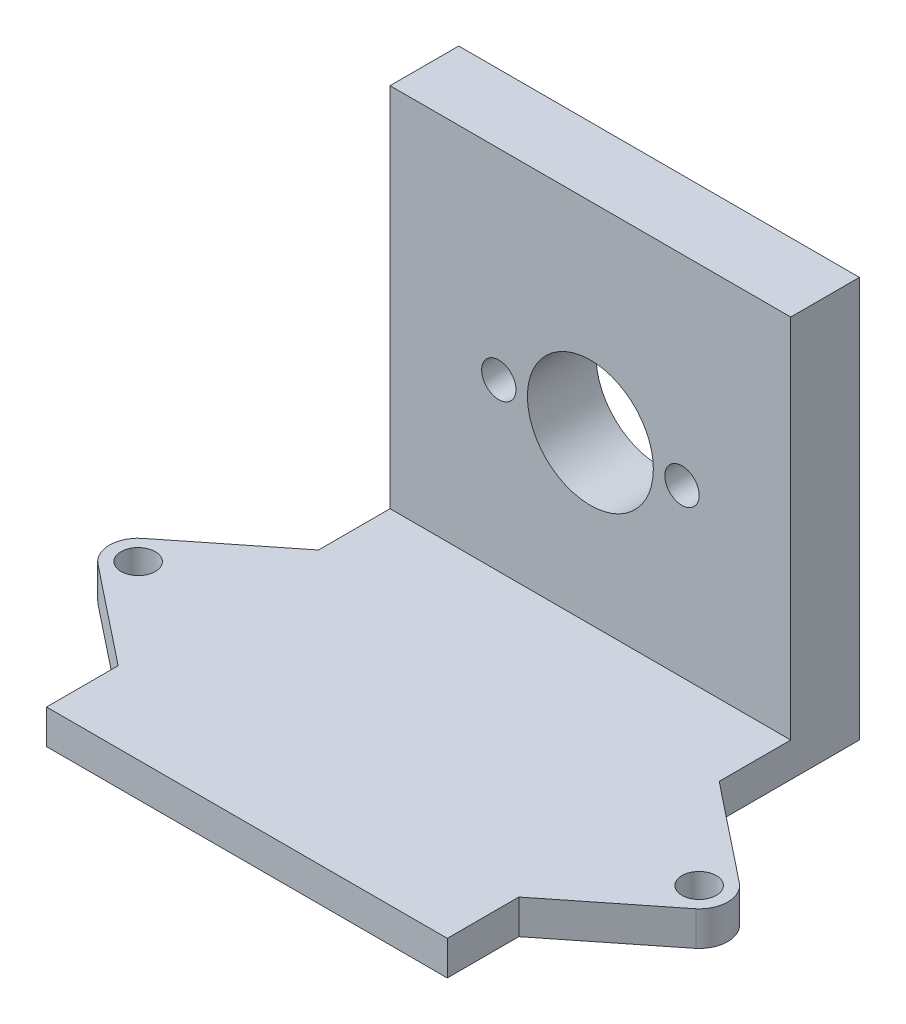
ISO-10303-21;
HEADER;
FILE_DESCRIPTION(('STEP AP214'),'2;1');
FILE_NAME('part.step','',(''),(''),'','','');
FILE_SCHEMA(('AUTOMOTIVE_DESIGN { 1 0 10303 214 1 1 1 1 }'));
ENDSEC;
DATA;
#1=APPLICATION_CONTEXT('core data for automotive mechanical design processes');
#2=APPLICATION_PROTOCOL_DEFINITION('international standard','automotive_design',2000,#1);
#3=PRODUCT_CONTEXT('',#1,'mechanical');
#4=PRODUCT('Part','Part','',(#3));
#5=PRODUCT_RELATED_PRODUCT_CATEGORY('part','',(#4));
#6=PRODUCT_DEFINITION_FORMATION('','',#4);
#7=PRODUCT_DEFINITION_CONTEXT('part definition',#1,'design');
#8=PRODUCT_DEFINITION('design','',#6,#7);
#9=PRODUCT_DEFINITION_SHAPE('','',#8);
#10=(LENGTH_UNIT() NAMED_UNIT(*) SI_UNIT(.MILLI.,.METRE.));
#11=(NAMED_UNIT(*) PLANE_ANGLE_UNIT() SI_UNIT($,.RADIAN.));
#12=(NAMED_UNIT(*) SI_UNIT($,.STERADIAN.) SOLID_ANGLE_UNIT());
#13=UNCERTAINTY_MEASURE_WITH_UNIT(LENGTH_MEASURE(1.E-05),#10,'distance_accuracy_value','');
#14=(GEOMETRIC_REPRESENTATION_CONTEXT(3) GLOBAL_UNCERTAINTY_ASSIGNED_CONTEXT((#13)) GLOBAL_UNIT_ASSIGNED_CONTEXT((#10,
#11,#12)) REPRESENTATION_CONTEXT('',''));
#15=CARTESIAN_POINT('',(0.,0.,0.));
#16=DIRECTION('',(0.,0.,1.));
#17=DIRECTION('',(1.,0.,0.));
#18=AXIS2_PLACEMENT_3D('',#15,#16,#17);
#19=CARTESIAN_POINT('',(-17.5,-17.5,6.));
#20=DIRECTION('',(1.,0.,0.));
#21=DIRECTION('',(0.,0.,-1.));
#22=AXIS2_PLACEMENT_3D('',#19,#20,#21);
#23=PLANE('',#22);
#24=DIRECTION('',(0.,1.,0.));
#25=VECTOR('',#24,1.);
#26=CARTESIAN_POINT('',(-17.5,-37.4123077517399,29.75));
#27=LINE('',#26,#25);
#28=CARTESIAN_POINT('',(-17.5,-17.5,29.75));
#29=VERTEX_POINT('',#28);
#30=CARTESIAN_POINT('',(-17.5,-14.5,29.75));
#31=VERTEX_POINT('',#30);
#32=EDGE_CURVE('E145',#29,#31,#27,.T.);
#33=ORIENTED_EDGE('',*,*,#32,.F.);
#34=DIRECTION('',(0.,0.,-1.));
#35=VECTOR('',#34,1.);
#36=CARTESIAN_POINT('',(-17.5,-17.5,6.));
#37=LINE('',#36,#35);
#38=CARTESIAN_POINT('',(-17.5,-17.5,36.));
#39=VERTEX_POINT('',#38);
#40=EDGE_CURVE('E263',#39,#29,#37,.T.);
#41=ORIENTED_EDGE('',*,*,#40,.F.);
#42=DIRECTION('',(0.,-1.,0.));
#43=VECTOR('',#42,1.);
#44=CARTESIAN_POINT('',(-17.5,-17.5,36.));
#45=LINE('',#44,#43);
#46=CARTESIAN_POINT('',(-17.5,-14.5,36.));
#47=VERTEX_POINT('',#46);
#48=EDGE_CURVE('E207',#47,#39,#45,.T.);
#49=ORIENTED_EDGE('',*,*,#48,.F.);
#50=DIRECTION('',(0.,0.,-1.));
#51=VECTOR('',#50,1.);
#52=CARTESIAN_POINT('',(-17.5,-14.5,36.));
#53=LINE('',#52,#51);
#54=EDGE_CURVE('E219',#47,#31,#53,.T.);
#55=ORIENTED_EDGE('',*,*,#54,.T.);
#56=EDGE_LOOP('',(#33,#41,#49,#55));
#57=FACE_BOUND('',#56,.T.);
#58=ADVANCED_FACE('F34',(#57),#23,.F.);
#59=CARTESIAN_POINT('',(17.5,-17.5,6.));
#60=DIRECTION('',(-1.,0.,0.));
#61=DIRECTION('',(0.,0.,1.));
#62=AXIS2_PLACEMENT_3D('',#59,#60,#61);
#63=PLANE('',#62);
#64=DIRECTION('',(0.,1.,0.));
#65=VECTOR('',#64,1.);
#66=CARTESIAN_POINT('',(17.5,-37.4123077517399,12.25));
#67=LINE('',#66,#65);
#68=CARTESIAN_POINT('',(17.5,-17.5,12.25));
#69=VERTEX_POINT('',#68);
#70=CARTESIAN_POINT('',(17.5,-14.5,12.25));
#71=VERTEX_POINT('',#70);
#72=EDGE_CURVE('E198',#69,#71,#67,.T.);
#73=ORIENTED_EDGE('',*,*,#72,.F.);
#74=DIRECTION('',(0.,0.,-1.));
#75=VECTOR('',#74,1.);
#76=CARTESIAN_POINT('',(17.5,-17.5,6.));
#77=LINE('',#76,#75);
#78=CARTESIAN_POINT('',(17.5,-17.5,0.));
#79=VERTEX_POINT('',#78);
#80=EDGE_CURVE('E252',#69,#79,#77,.T.);
#81=ORIENTED_EDGE('',*,*,#80,.T.);
#82=DIRECTION('',(0.,1.,0.));
#83=VECTOR('',#82,1.);
#84=CARTESIAN_POINT('',(17.5,-17.5,0.));
#85=LINE('',#84,#83);
#86=CARTESIAN_POINT('',(17.5,17.5,0.));
#87=VERTEX_POINT('',#86);
#88=EDGE_CURVE('E241',#79,#87,#85,.T.);
#89=ORIENTED_EDGE('',*,*,#88,.T.);
#90=DIRECTION('',(0.,0.,-1.));
#91=VECTOR('',#90,1.);
#92=CARTESIAN_POINT('',(17.5,17.5,6.));
#93=LINE('',#92,#91);
#94=CARTESIAN_POINT('',(17.5,17.5,6.));
#95=VERTEX_POINT('',#94);
#96=EDGE_CURVE('E11',#95,#87,#93,.T.);
#97=ORIENTED_EDGE('',*,*,#96,.F.);
#98=DIRECTION('',(0.,1.,0.));
#99=VECTOR('',#98,1.);
#100=CARTESIAN_POINT('',(17.5,-17.5,6.));
#101=LINE('',#100,#99);
#102=CARTESIAN_POINT('',(17.5,-14.5,6.));
#103=VERTEX_POINT('',#102);
#104=EDGE_CURVE('E244',#103,#95,#101,.T.);
#105=ORIENTED_EDGE('',*,*,#104,.F.);
#106=DIRECTION('',(0.,0.,-1.));
#107=VECTOR('',#106,1.);
#108=CARTESIAN_POINT('',(17.5,-14.5,36.));
#109=LINE('',#108,#107);
#110=EDGE_CURVE('E221',#71,#103,#109,.T.);
#111=ORIENTED_EDGE('',*,*,#110,.F.);
#112=EDGE_LOOP('',(#73,#81,#89,#97,#105,#111));
#113=FACE_BOUND('',#112,.T.);
#114=ADVANCED_FACE('F298',(#113),#63,.F.);
#115=CARTESIAN_POINT('',(0.,0.,6.));
#116=DIRECTION('',(0.,0.,-1.));
#117=DIRECTION('',(-1.,0.,0.));
#118=AXIS2_PLACEMENT_3D('',#115,#116,#117);
#119=PLANE('',#118);
#120=CARTESIAN_POINT('',(-8.,0.,6.));
#121=DIRECTION('',(0.,0.,1.));
#122=DIRECTION('',(1.,0.,0.));
#123=AXIS2_PLACEMENT_3D('',#120,#121,#122);
#124=CIRCLE('',#123,1.5);
#125=CARTESIAN_POINT('',(-6.5,0.,6.));
#126=VERTEX_POINT('',#125);
#127=EDGE_CURVE('E226',#126,#126,#124,.T.);
#128=ORIENTED_EDGE('',*,*,#127,.F.);
#129=EDGE_LOOP('',(#128));
#130=FACE_BOUND('',#129,.T.);
#131=CARTESIAN_POINT('',(8.,0.,6.));
#132=DIRECTION('',(0.,0.,1.));
#133=DIRECTION('',(1.,0.,0.));
#134=AXIS2_PLACEMENT_3D('',#131,#132,#133);
#135=CIRCLE('',#134,1.5);
#136=CARTESIAN_POINT('',(9.5,0.,6.));
#137=VERTEX_POINT('',#136);
#138=EDGE_CURVE('E232',#137,#137,#135,.T.);
#139=ORIENTED_EDGE('',*,*,#138,.F.);
#140=EDGE_LOOP('',(#139));
#141=FACE_BOUND('',#140,.T.);
#142=CARTESIAN_POINT('',(0.,0.,6.));
#143=DIRECTION('',(0.,0.,1.));
#144=DIRECTION('',(1.,0.,0.));
#145=AXIS2_PLACEMENT_3D('',#142,#143,#144);
#146=CIRCLE('',#145,5.5);
#147=CARTESIAN_POINT('',(5.49999999999999,0.,6.));
#148=VERTEX_POINT('',#147);
#149=EDGE_CURVE('E238',#148,#148,#146,.T.);
#150=ORIENTED_EDGE('',*,*,#149,.F.);
#151=EDGE_LOOP('',(#150));
#152=FACE_BOUND('',#151,.T.);
#153=DIRECTION('',(-1.,0.,0.));
#154=VECTOR('',#153,1.);
#155=CARTESIAN_POINT('',(-17.5,-14.5,6.));
#156=LINE('',#155,#154);
#157=CARTESIAN_POINT('',(-17.5,-14.5,6.));
#158=VERTEX_POINT('',#157);
#159=EDGE_CURVE('E206',#103,#158,#156,.T.);
#160=ORIENTED_EDGE('',*,*,#159,.F.);
#161=ORIENTED_EDGE('',*,*,#104,.T.);
#162=DIRECTION('',(-1.,0.,0.));
#163=VECTOR('',#162,1.);
#164=CARTESIAN_POINT('',(-17.5,17.5,6.));
#165=LINE('',#164,#163);
#166=CARTESIAN_POINT('',(-17.5,17.5,6.));
#167=VERTEX_POINT('',#166);
#168=EDGE_CURVE('E246',#95,#167,#165,.T.);
#169=ORIENTED_EDGE('',*,*,#168,.T.);
#170=DIRECTION('',(0.,-1.,0.));
#171=VECTOR('',#170,1.);
#172=CARTESIAN_POINT('',(-17.5,-17.5,6.));
#173=LINE('',#172,#171);
#174=EDGE_CURVE('E249',#167,#158,#173,.T.);
#175=ORIENTED_EDGE('',*,*,#174,.T.);
#176=EDGE_LOOP('',(#160,#161,#169,#175));
#177=FACE_BOUND('',#176,.T.);
#178=ADVANCED_FACE('F304',(#130,#141,#152,#177),#119,.F.);
#179=CARTESIAN_POINT('',(0.,0.,0.));
#180=DIRECTION('',(0.,0.,-1.));
#181=DIRECTION('',(-1.,0.,0.));
#182=AXIS2_PLACEMENT_3D('',#179,#180,#181);
#183=PLANE('',#182);
#184=CARTESIAN_POINT('',(8.,0.,0.));
#185=DIRECTION('',(0.,0.,1.));
#186=DIRECTION('',(1.,0.,0.));
#187=AXIS2_PLACEMENT_3D('',#184,#185,#186);
#188=CIRCLE('',#187,1.5);
#189=CARTESIAN_POINT('',(9.5,0.,0.));
#190=VERTEX_POINT('',#189);
#191=EDGE_CURVE('E229',#190,#190,#188,.T.);
#192=ORIENTED_EDGE('',*,*,#191,.T.);
#193=EDGE_LOOP('',(#192));
#194=FACE_BOUND('',#193,.T.);
#195=ORIENTED_EDGE('',*,*,#88,.F.);
#196=DIRECTION('',(1.,0.,0.));
#197=VECTOR('',#196,1.);
#198=CARTESIAN_POINT('',(-17.5,-17.5,0.));
#199=LINE('',#198,#197);
#200=CARTESIAN_POINT('',(-17.5,-17.5,0.));
#201=VERTEX_POINT('',#200);
#202=EDGE_CURVE('E247',#201,#79,#199,.T.);
#203=ORIENTED_EDGE('',*,*,#202,.F.);
#204=DIRECTION('',(0.,-1.,0.));
#205=VECTOR('',#204,1.);
#206=CARTESIAN_POINT('',(-17.5,-17.5,0.));
#207=LINE('',#206,#205);
#208=CARTESIAN_POINT('',(-17.5,17.5,0.));
#209=VERTEX_POINT('',#208);
#210=EDGE_CURVE('E257',#209,#201,#207,.T.);
#211=ORIENTED_EDGE('',*,*,#210,.F.);
#212=DIRECTION('',(-1.,0.,0.));
#213=VECTOR('',#212,1.);
#214=CARTESIAN_POINT('',(-17.5,17.5,0.));
#215=LINE('',#214,#213);
#216=EDGE_CURVE('E255',#87,#209,#215,.T.);
#217=ORIENTED_EDGE('',*,*,#216,.F.);
#218=EDGE_LOOP('',(#195,#203,#211,#217));
#219=FACE_BOUND('',#218,.T.);
#220=CARTESIAN_POINT('',(0.,0.,0.));
#221=DIRECTION('',(0.,0.,1.));
#222=DIRECTION('',(1.,0.,0.));
#223=AXIS2_PLACEMENT_3D('',#220,#221,#222);
#224=CIRCLE('',#223,5.5);
#225=CARTESIAN_POINT('',(5.49999999999999,0.,0.));
#226=VERTEX_POINT('',#225);
#227=EDGE_CURVE('E235',#226,#226,#224,.T.);
#228=ORIENTED_EDGE('',*,*,#227,.T.);
#229=EDGE_LOOP('',(#228));
#230=FACE_BOUND('',#229,.T.);
#231=CARTESIAN_POINT('',(-8.,0.,0.));
#232=DIRECTION('',(0.,0.,1.));
#233=DIRECTION('',(1.,0.,0.));
#234=AXIS2_PLACEMENT_3D('',#231,#232,#233);
#235=CIRCLE('',#234,1.5);
#236=CARTESIAN_POINT('',(-6.5,0.,0.));
#237=VERTEX_POINT('',#236);
#238=EDGE_CURVE('E225',#237,#237,#235,.T.);
#239=ORIENTED_EDGE('',*,*,#238,.T.);
#240=EDGE_LOOP('',(#239));
#241=FACE_BOUND('',#240,.T.);
#242=ADVANCED_FACE('F275',(#194,#219,#230,#241),#183,.T.);
#243=CARTESIAN_POINT('',(17.5,-17.5,36.));
#244=VERTEX_POINT('',#243);
#245=CARTESIAN_POINT('',(17.5,-17.5,29.75));
#246=VERTEX_POINT('',#245);
#247=EDGE_CURVE('E261',#244,#246,#77,.T.);
#248=ORIENTED_EDGE('',*,*,#247,.T.);
#249=DIRECTION('',(0.,1.,0.));
#250=VECTOR('',#249,1.);
#251=CARTESIAN_POINT('',(17.5,-37.4123077517399,29.75));
#252=LINE('',#251,#250);
#253=CARTESIAN_POINT('',(17.5,-14.5,29.75));
#254=VERTEX_POINT('',#253);
#255=EDGE_CURVE('E182',#246,#254,#252,.T.);
#256=ORIENTED_EDGE('',*,*,#255,.T.);
#257=CARTESIAN_POINT('',(17.5,-14.5,36.));
#258=VERTEX_POINT('',#257);
#259=EDGE_CURVE('E222',#258,#254,#109,.T.);
#260=ORIENTED_EDGE('',*,*,#259,.F.);
#261=DIRECTION('',(0.,1.,0.));
#262=VECTOR('',#261,1.);
#263=CARTESIAN_POINT('',(17.5,-17.5,36.));
#264=LINE('',#263,#262);
#265=EDGE_CURVE('E213',#244,#258,#264,.T.);
#266=ORIENTED_EDGE('',*,*,#265,.F.);
#267=EDGE_LOOP('',(#248,#256,#260,#266));
#268=FACE_BOUND('',#267,.T.);
#269=ADVANCED_FACE('F36',(#268),#63,.F.);
#270=CARTESIAN_POINT('',(-17.5,17.5,6.));
#271=DIRECTION('',(0.,-1.,0.));
#272=DIRECTION('',(0.,0.,-1.));
#273=AXIS2_PLACEMENT_3D('',#270,#271,#272);
#274=PLANE('',#273);
#275=ORIENTED_EDGE('',*,*,#216,.T.);
#276=DIRECTION('',(0.,0.,-1.));
#277=VECTOR('',#276,1.);
#278=CARTESIAN_POINT('',(-17.5,17.5,6.));
#279=LINE('',#278,#277);
#280=EDGE_CURVE('E42',#167,#209,#279,.T.);
#281=ORIENTED_EDGE('',*,*,#280,.F.);
#282=ORIENTED_EDGE('',*,*,#168,.F.);
#283=ORIENTED_EDGE('',*,*,#96,.T.);
#284=EDGE_LOOP('',(#275,#281,#282,#283));
#285=FACE_BOUND('',#284,.T.);
#286=ADVANCED_FACE('F308',(#285),#274,.F.);
#287=CARTESIAN_POINT('',(-17.5,-17.5,12.25));
#288=VERTEX_POINT('',#287);
#289=EDGE_CURVE('E54',#288,#201,#37,.T.);
#290=ORIENTED_EDGE('',*,*,#289,.F.);
#291=DIRECTION('',(0.,1.,0.));
#292=VECTOR('',#291,1.);
#293=CARTESIAN_POINT('',(-17.5,-37.4123077517399,12.25));
#294=LINE('',#293,#292);
#295=CARTESIAN_POINT('',(-17.5,-14.5,12.25));
#296=VERTEX_POINT('',#295);
#297=EDGE_CURVE('E49',#288,#296,#294,.T.);
#298=ORIENTED_EDGE('',*,*,#297,.T.);
#299=EDGE_CURVE('E217',#296,#158,#53,.T.);
#300=ORIENTED_EDGE('',*,*,#299,.T.);
#301=ORIENTED_EDGE('',*,*,#174,.F.);
#302=ORIENTED_EDGE('',*,*,#280,.T.);
#303=ORIENTED_EDGE('',*,*,#210,.T.);
#304=EDGE_LOOP('',(#290,#298,#300,#301,#302,#303));
#305=FACE_BOUND('',#304,.T.);
#306=ADVANCED_FACE('F269',(#305),#23,.F.);
#307=CARTESIAN_POINT('',(-17.5,-17.5,6.));
#308=DIRECTION('',(0.,1.,0.));
#309=DIRECTION('',(0.,0.,1.));
#310=AXIS2_PLACEMENT_3D('',#307,#308,#309);
#311=PLANE('',#310);
#312=ORIENTED_EDGE('',*,*,#202,.T.);
#313=ORIENTED_EDGE('',*,*,#80,.F.);
#314=DIRECTION('',(0.783098213875571,0.,0.621898052276167));
#315=VECTOR('',#314,1.);
#316=CARTESIAN_POINT('',(17.5,-17.5,12.25));
#317=LINE('',#316,#315);
#318=CARTESIAN_POINT('',(26.1140803526313,-17.5,19.0908785750378));
#319=VERTEX_POINT('',#318);
#320=EDGE_CURVE('E180',#69,#319,#317,.T.);
#321=ORIENTED_EDGE('',*,*,#320,.T.);
#322=CARTESIAN_POINT('',(24.5,-17.5,21.));
#323=DIRECTION('',(0.,1.,0.));
#324=DIRECTION('',(0.,0.,1.));
#325=AXIS2_PLACEMENT_3D('',#322,#323,#324);
#326=CIRCLE('',#325,2.5);
#327=CARTESIAN_POINT('',(26.1140803526313,-17.5,22.9091214249622));
#328=VERTEX_POINT('',#327);
#329=EDGE_CURVE('E176',#319,#328,#326,.F.);
#330=ORIENTED_EDGE('',*,*,#329,.T.);
#331=DIRECTION('',(-0.783098213875572,0.,0.621898052276167));
#332=VECTOR('',#331,1.);
#333=CARTESIAN_POINT('',(17.5,-17.5,29.75));
#334=LINE('',#333,#332);
#335=EDGE_CURVE('E179',#328,#246,#334,.T.);
#336=ORIENTED_EDGE('',*,*,#335,.T.);
#337=ORIENTED_EDGE('',*,*,#247,.F.);
#338=DIRECTION('',(1.,0.,0.));
#339=VECTOR('',#338,1.);
#340=CARTESIAN_POINT('',(-17.5,-17.5,36.));
#341=LINE('',#340,#339);
#342=EDGE_CURVE('E210',#39,#244,#341,.T.);
#343=ORIENTED_EDGE('',*,*,#342,.F.);
#344=ORIENTED_EDGE('',*,*,#40,.T.);
#345=DIRECTION('',(-0.783098213875572,0.,-0.621898052276166));
#346=VECTOR('',#345,1.);
#347=CARTESIAN_POINT('',(-17.5,-17.5,29.75));
#348=LINE('',#347,#346);
#349=CARTESIAN_POINT('',(-26.1140803526313,-17.5,22.9091214249622));
#350=VERTEX_POINT('',#349);
#351=EDGE_CURVE('E175',#29,#350,#348,.T.);
#352=ORIENTED_EDGE('',*,*,#351,.T.);
#353=CARTESIAN_POINT('',(-24.5,-17.5,21.));
#354=DIRECTION('',(0.,1.,0.));
#355=DIRECTION('',(0.,0.,1.));
#356=AXIS2_PLACEMENT_3D('',#353,#354,#355);
#357=CIRCLE('',#356,2.5);
#358=CARTESIAN_POINT('',(-26.1140803526313,-17.5,19.0908785750378));
#359=VERTEX_POINT('',#358);
#360=EDGE_CURVE('E142',#350,#359,#357,.F.);
#361=ORIENTED_EDGE('',*,*,#360,.T.);
#362=DIRECTION('',(0.783098213875571,0.,-0.621898052276167));
#363=VECTOR('',#362,1.);
#364=CARTESIAN_POINT('',(-17.5,-17.5,12.25));
#365=LINE('',#364,#363);
#366=EDGE_CURVE('E168',#359,#288,#365,.T.);
#367=ORIENTED_EDGE('',*,*,#366,.T.);
#368=ORIENTED_EDGE('',*,*,#289,.T.);
#369=EDGE_LOOP('',(#312,#313,#321,#330,#336,#337,#343,#344,#352,#361,#367,#368));
#370=FACE_BOUND('',#369,.T.);
#371=CARTESIAN_POINT('',(24.5,-17.5,21.));
#372=DIRECTION('',(0.,1.,0.));
#373=DIRECTION('',(0.,0.,1.));
#374=AXIS2_PLACEMENT_3D('',#371,#372,#373);
#375=CIRCLE('',#374,1.5);
#376=CARTESIAN_POINT('',(24.5,-17.5,22.5));
#377=VERTEX_POINT('',#376);
#378=EDGE_CURVE('E178',#377,#377,#375,.F.);
#379=ORIENTED_EDGE('',*,*,#378,.F.);
#380=EDGE_LOOP('',(#379));
#381=FACE_BOUND('',#380,.T.);
#382=CARTESIAN_POINT('',(-24.5,-17.5,21.));
#383=DIRECTION('',(0.,1.,0.));
#384=DIRECTION('',(0.,0.,1.));
#385=AXIS2_PLACEMENT_3D('',#382,#383,#384);
#386=CIRCLE('',#385,1.5);
#387=CARTESIAN_POINT('',(-24.5,-17.5,22.5));
#388=VERTEX_POINT('',#387);
#389=EDGE_CURVE('E171',#388,#388,#386,.F.);
#390=ORIENTED_EDGE('',*,*,#389,.F.);
#391=EDGE_LOOP('',(#390));
#392=FACE_BOUND('',#391,.T.);
#393=ADVANCED_FACE('F279',(#370,#381,#392),#311,.F.);
#394=CARTESIAN_POINT('',(0.,0.,6.));
#395=DIRECTION('',(0.,0.,-1.));
#396=DIRECTION('',(-1.,0.,0.));
#397=AXIS2_PLACEMENT_3D('',#394,#395,#396);
#398=CYLINDRICAL_SURFACE('',#397,5.5);
#399=ORIENTED_EDGE('',*,*,#149,.T.);
#400=EDGE_LOOP('',(#399));
#401=FACE_BOUND('',#400,.T.);
#402=ORIENTED_EDGE('',*,*,#227,.F.);
#403=EDGE_LOOP('',(#402));
#404=FACE_BOUND('',#403,.T.);
#405=ADVANCED_FACE('F313',(#401,#404),#398,.F.);
#406=CARTESIAN_POINT('',(8.,0.,6.));
#407=DIRECTION('',(0.,0.,-1.));
#408=DIRECTION('',(-1.,0.,0.));
#409=AXIS2_PLACEMENT_3D('',#406,#407,#408);
#410=CYLINDRICAL_SURFACE('',#409,1.5);
#411=ORIENTED_EDGE('',*,*,#138,.T.);
#412=EDGE_LOOP('',(#411));
#413=FACE_BOUND('',#412,.T.);
#414=ORIENTED_EDGE('',*,*,#191,.F.);
#415=EDGE_LOOP('',(#414));
#416=FACE_BOUND('',#415,.T.);
#417=ADVANCED_FACE('F356',(#413,#416),#410,.F.);
#418=CARTESIAN_POINT('',(-8.,0.,6.));
#419=DIRECTION('',(0.,0.,-1.));
#420=DIRECTION('',(-1.,0.,0.));
#421=AXIS2_PLACEMENT_3D('',#418,#419,#420);
#422=CYLINDRICAL_SURFACE('',#421,1.5);
#423=ORIENTED_EDGE('',*,*,#127,.T.);
#424=EDGE_LOOP('',(#423));
#425=FACE_BOUND('',#424,.T.);
#426=ORIENTED_EDGE('',*,*,#238,.F.);
#427=EDGE_LOOP('',(#426));
#428=FACE_BOUND('',#427,.T.);
#429=ADVANCED_FACE('F350',(#425,#428),#422,.F.);
#430=CARTESIAN_POINT('',(-17.5,-14.5,36.));
#431=DIRECTION('',(0.,-1.,0.));
#432=DIRECTION('',(0.,0.,-1.));
#433=AXIS2_PLACEMENT_3D('',#430,#431,#432);
#434=PLANE('',#433);
#435=ORIENTED_EDGE('',*,*,#159,.T.);
#436=ORIENTED_EDGE('',*,*,#299,.F.);
#437=DIRECTION('',(-0.783098213875571,0.,0.621898052276167));
#438=VECTOR('',#437,1.);
#439=CARTESIAN_POINT('',(-17.5,-14.5,12.25));
#440=LINE('',#439,#438);
#441=CARTESIAN_POINT('',(-26.1140803526313,-14.5,19.0908785750378));
#442=VERTEX_POINT('',#441);
#443=EDGE_CURVE('E146',#296,#442,#440,.T.);
#444=ORIENTED_EDGE('',*,*,#443,.T.);
#445=CARTESIAN_POINT('',(-24.5,-14.5,21.));
#446=DIRECTION('',(0.,1.,0.));
#447=DIRECTION('',(0.,0.,-1.));
#448=AXIS2_PLACEMENT_3D('',#445,#446,#447);
#449=CIRCLE('',#448,2.5);
#450=CARTESIAN_POINT('',(-26.1140803526313,-14.5,22.9091214249622));
#451=VERTEX_POINT('',#450);
#452=EDGE_CURVE('E140',#442,#451,#449,.T.);
#453=ORIENTED_EDGE('',*,*,#452,.T.);
#454=DIRECTION('',(0.783098213875572,0.,0.621898052276166));
#455=VECTOR('',#454,1.);
#456=CARTESIAN_POINT('',(-17.5,-14.5,29.75));
#457=LINE('',#456,#455);
#458=EDGE_CURVE('E150',#451,#31,#457,.T.);
#459=ORIENTED_EDGE('',*,*,#458,.T.);
#460=ORIENTED_EDGE('',*,*,#54,.F.);
#461=DIRECTION('',(-1.,0.,0.));
#462=VECTOR('',#461,1.);
#463=CARTESIAN_POINT('',(-17.5,-14.5,36.));
#464=LINE('',#463,#462);
#465=EDGE_CURVE('E215',#258,#47,#464,.T.);
#466=ORIENTED_EDGE('',*,*,#465,.F.);
#467=ORIENTED_EDGE('',*,*,#259,.T.);
#468=DIRECTION('',(0.783098213875572,0.,-0.621898052276167));
#469=VECTOR('',#468,1.);
#470=CARTESIAN_POINT('',(17.5,-14.5,29.75));
#471=LINE('',#470,#469);
#472=CARTESIAN_POINT('',(26.1140803526313,-14.5,22.9091214249622));
#473=VERTEX_POINT('',#472);
#474=EDGE_CURVE('E187',#254,#473,#471,.T.);
#475=ORIENTED_EDGE('',*,*,#474,.T.);
#476=CARTESIAN_POINT('',(24.5,-14.5,21.));
#477=DIRECTION('',(0.,1.,0.));
#478=DIRECTION('',(0.,0.,1.));
#479=AXIS2_PLACEMENT_3D('',#476,#477,#478);
#480=CIRCLE('',#479,2.5);
#481=CARTESIAN_POINT('',(26.1140803526313,-14.5,19.0908785750378));
#482=VERTEX_POINT('',#481);
#483=EDGE_CURVE('E190',#473,#482,#480,.T.);
#484=ORIENTED_EDGE('',*,*,#483,.T.);
#485=DIRECTION('',(-0.783098213875572,0.,-0.621898052276167));
#486=VECTOR('',#485,1.);
#487=CARTESIAN_POINT('',(17.5,-14.5,12.25));
#488=LINE('',#487,#486);
#489=EDGE_CURVE('E193',#482,#71,#488,.T.);
#490=ORIENTED_EDGE('',*,*,#489,.T.);
#491=ORIENTED_EDGE('',*,*,#110,.T.);
#492=EDGE_LOOP('',(#435,#436,#444,#453,#459,#460,#466,#467,#475,#484,#490,#491));
#493=FACE_BOUND('',#492,.T.);
#494=CARTESIAN_POINT('',(24.5,-14.5,21.));
#495=DIRECTION('',(0.,1.,0.));
#496=DIRECTION('',(0.,0.,1.));
#497=AXIS2_PLACEMENT_3D('',#494,#495,#496);
#498=CIRCLE('',#497,1.5);
#499=CARTESIAN_POINT('',(24.5,-14.5,22.5));
#500=VERTEX_POINT('',#499);
#501=EDGE_CURVE('E174',#500,#500,#498,.T.);
#502=ORIENTED_EDGE('',*,*,#501,.F.);
#503=EDGE_LOOP('',(#502));
#504=FACE_BOUND('',#503,.T.);
#505=CARTESIAN_POINT('',(-24.5,-14.5,21.));
#506=DIRECTION('',(0.,1.,0.));
#507=DIRECTION('',(0.,0.,-1.));
#508=AXIS2_PLACEMENT_3D('',#505,#506,#507);
#509=CIRCLE('',#508,1.5);
#510=CARTESIAN_POINT('',(-24.5,-14.5,19.5));
#511=VERTEX_POINT('',#510);
#512=EDGE_CURVE('E159',#511,#511,#509,.T.);
#513=ORIENTED_EDGE('',*,*,#512,.F.);
#514=EDGE_LOOP('',(#513));
#515=FACE_BOUND('',#514,.T.);
#516=ADVANCED_FACE('F156',(#493,#504,#515),#434,.F.);
#517=CARTESIAN_POINT('',(0.,0.,36.));
#518=DIRECTION('',(0.,0.,-1.));
#519=DIRECTION('',(-1.,0.,0.));
#520=AXIS2_PLACEMENT_3D('',#517,#518,#519);
#521=PLANE('',#520);
#522=ORIENTED_EDGE('',*,*,#48,.T.);
#523=ORIENTED_EDGE('',*,*,#342,.T.);
#524=ORIENTED_EDGE('',*,*,#265,.T.);
#525=ORIENTED_EDGE('',*,*,#465,.T.);
#526=EDGE_LOOP('',(#522,#523,#524,#525));
#527=FACE_BOUND('',#526,.T.);
#528=ADVANCED_FACE('F340',(#527),#521,.F.);
#529=CARTESIAN_POINT('',(24.5,-37.4123077517399,21.));
#530=DIRECTION('',(0.,1.,0.));
#531=DIRECTION('',(0.,0.,1.));
#532=AXIS2_PLACEMENT_3D('',#529,#530,#531);
#533=CYLINDRICAL_SURFACE('',#532,2.5);
#534=ORIENTED_EDGE('',*,*,#329,.F.);
#535=DIRECTION('',(0.,1.,0.));
#536=VECTOR('',#535,1.);
#537=CARTESIAN_POINT('',(26.1140803526313,-37.4123077517399,19.0908785750378));
#538=LINE('',#537,#536);
#539=EDGE_CURVE('E201',#319,#482,#538,.T.);
#540=ORIENTED_EDGE('',*,*,#539,.T.);
#541=ORIENTED_EDGE('',*,*,#483,.F.);
#542=DIRECTION('',(0.,1.,0.));
#543=VECTOR('',#542,1.);
#544=CARTESIAN_POINT('',(26.1140803526313,-37.4123077517399,22.9091214249622));
#545=LINE('',#544,#543);
#546=EDGE_CURVE('E196',#328,#473,#545,.T.);
#547=ORIENTED_EDGE('',*,*,#546,.F.);
#548=EDGE_LOOP('',(#534,#540,#541,#547));
#549=FACE_BOUND('',#548,.T.);
#550=ADVANCED_FACE('F330',(#549),#533,.T.);
#551=CARTESIAN_POINT('',(17.5,-37.4123077517399,12.25));
#552=DIRECTION('',(0.621898052276167,0.,-0.783098213875571));
#553=DIRECTION('',(-0.783098213875571,0.,-0.621898052276167));
#554=AXIS2_PLACEMENT_3D('',#551,#552,#553);
#555=PLANE('',#554);
#556=ORIENTED_EDGE('',*,*,#320,.F.);
#557=ORIENTED_EDGE('',*,*,#72,.T.);
#558=ORIENTED_EDGE('',*,*,#489,.F.);
#559=ORIENTED_EDGE('',*,*,#539,.F.);
#560=EDGE_LOOP('',(#556,#557,#558,#559));
#561=FACE_BOUND('',#560,.T.);
#562=ADVANCED_FACE('F322',(#561),#555,.T.);
#563=CARTESIAN_POINT('',(17.5,-37.4123077517399,29.75));
#564=DIRECTION('',(0.621898052276166,0.,0.783098213875571));
#565=DIRECTION('',(0.783098213875572,0.,-0.621898052276167));
#566=AXIS2_PLACEMENT_3D('',#563,#564,#565);
#567=PLANE('',#566);
#568=ORIENTED_EDGE('',*,*,#335,.F.);
#569=ORIENTED_EDGE('',*,*,#546,.T.);
#570=ORIENTED_EDGE('',*,*,#474,.F.);
#571=ORIENTED_EDGE('',*,*,#255,.F.);
#572=EDGE_LOOP('',(#568,#569,#570,#571));
#573=FACE_BOUND('',#572,.T.);
#574=ADVANCED_FACE('F334',(#573),#567,.T.);
#575=CARTESIAN_POINT('',(24.5,-37.4123077517399,21.));
#576=DIRECTION('',(0.,1.,0.));
#577=DIRECTION('',(0.,0.,1.));
#578=AXIS2_PLACEMENT_3D('',#575,#576,#577);
#579=CYLINDRICAL_SURFACE('',#578,1.5);
#580=ORIENTED_EDGE('',*,*,#378,.T.);
#581=EDGE_LOOP('',(#580));
#582=FACE_BOUND('',#581,.T.);
#583=ORIENTED_EDGE('',*,*,#501,.T.);
#584=EDGE_LOOP('',(#583));
#585=FACE_BOUND('',#584,.T.);
#586=ADVANCED_FACE('F294',(#582,#585),#579,.F.);
#587=CARTESIAN_POINT('',(-17.5,-37.4123077517399,29.75));
#588=DIRECTION('',(-0.621898052276166,0.,0.783098213875572));
#589=DIRECTION('',(0.783098213875572,0.,0.621898052276166));
#590=AXIS2_PLACEMENT_3D('',#587,#588,#589);
#591=PLANE('',#590);
#592=ORIENTED_EDGE('',*,*,#351,.F.);
#593=ORIENTED_EDGE('',*,*,#32,.T.);
#594=ORIENTED_EDGE('',*,*,#458,.F.);
#595=DIRECTION('',(0.,1.,0.));
#596=VECTOR('',#595,1.);
#597=CARTESIAN_POINT('',(-26.1140803526313,-37.4123077517399,22.9091214249622));
#598=LINE('',#597,#596);
#599=EDGE_CURVE('E135',#350,#451,#598,.T.);
#600=ORIENTED_EDGE('',*,*,#599,.F.);
#601=EDGE_LOOP('',(#592,#593,#594,#600));
#602=FACE_BOUND('',#601,.T.);
#603=ADVANCED_FACE('F151',(#602),#591,.T.);
#604=CARTESIAN_POINT('',(-17.5,-37.4123077517399,12.25));
#605=DIRECTION('',(-0.621898052276167,0.,-0.783098213875571));
#606=DIRECTION('',(-0.783098213875571,0.,0.621898052276167));
#607=AXIS2_PLACEMENT_3D('',#604,#605,#606);
#608=PLANE('',#607);
#609=ORIENTED_EDGE('',*,*,#366,.F.);
#610=DIRECTION('',(0.,1.,0.));
#611=VECTOR('',#610,1.);
#612=CARTESIAN_POINT('',(-26.1140803526313,-37.4123077517399,19.0908785750378));
#613=LINE('',#612,#611);
#614=EDGE_CURVE('E166',#359,#442,#613,.T.);
#615=ORIENTED_EDGE('',*,*,#614,.T.);
#616=ORIENTED_EDGE('',*,*,#443,.F.);
#617=ORIENTED_EDGE('',*,*,#297,.F.);
#618=EDGE_LOOP('',(#609,#615,#616,#617));
#619=FACE_BOUND('',#618,.T.);
#620=ADVANCED_FACE('F285',(#619),#608,.T.);
#621=CARTESIAN_POINT('',(-24.5,-37.4123077517399,21.));
#622=DIRECTION('',(0.,1.,0.));
#623=DIRECTION('',(0.,0.,1.));
#624=AXIS2_PLACEMENT_3D('',#621,#622,#623);
#625=CYLINDRICAL_SURFACE('',#624,2.5);
#626=ORIENTED_EDGE('',*,*,#360,.F.);
#627=ORIENTED_EDGE('',*,*,#599,.T.);
#628=ORIENTED_EDGE('',*,*,#452,.F.);
#629=ORIENTED_EDGE('',*,*,#614,.F.);
#630=EDGE_LOOP('',(#626,#627,#628,#629));
#631=FACE_BOUND('',#630,.T.);
#632=ADVANCED_FACE('F137',(#631),#625,.T.);
#633=CARTESIAN_POINT('',(-24.5,-37.4123077517399,21.));
#634=DIRECTION('',(0.,1.,0.));
#635=DIRECTION('',(0.,0.,1.));
#636=AXIS2_PLACEMENT_3D('',#633,#634,#635);
#637=CYLINDRICAL_SURFACE('',#636,1.5);
#638=ORIENTED_EDGE('',*,*,#389,.T.);
#639=EDGE_LOOP('',(#638));
#640=FACE_BOUND('',#639,.T.);
#641=ORIENTED_EDGE('',*,*,#512,.T.);
#642=EDGE_LOOP('',(#641));
#643=FACE_BOUND('',#642,.T.);
#644=ADVANCED_FACE('F292',(#640,#643),#637,.F.);
#645=CLOSED_SHELL('',(#58,#114,#178,#242,#269,#286,#306,#393,#405,#417,#429,#516,#528,#550,#562,
#574,#586,#603,#620,#632,#644));
#646=MANIFOLD_SOLID_BREP('B2',#645);
#647=ADVANCED_BREP_SHAPE_REPRESENTATION('',(#18,#646),#14);
#648=SHAPE_DEFINITION_REPRESENTATION(#9,#647);
ENDSEC;
END-ISO-10303-21;
